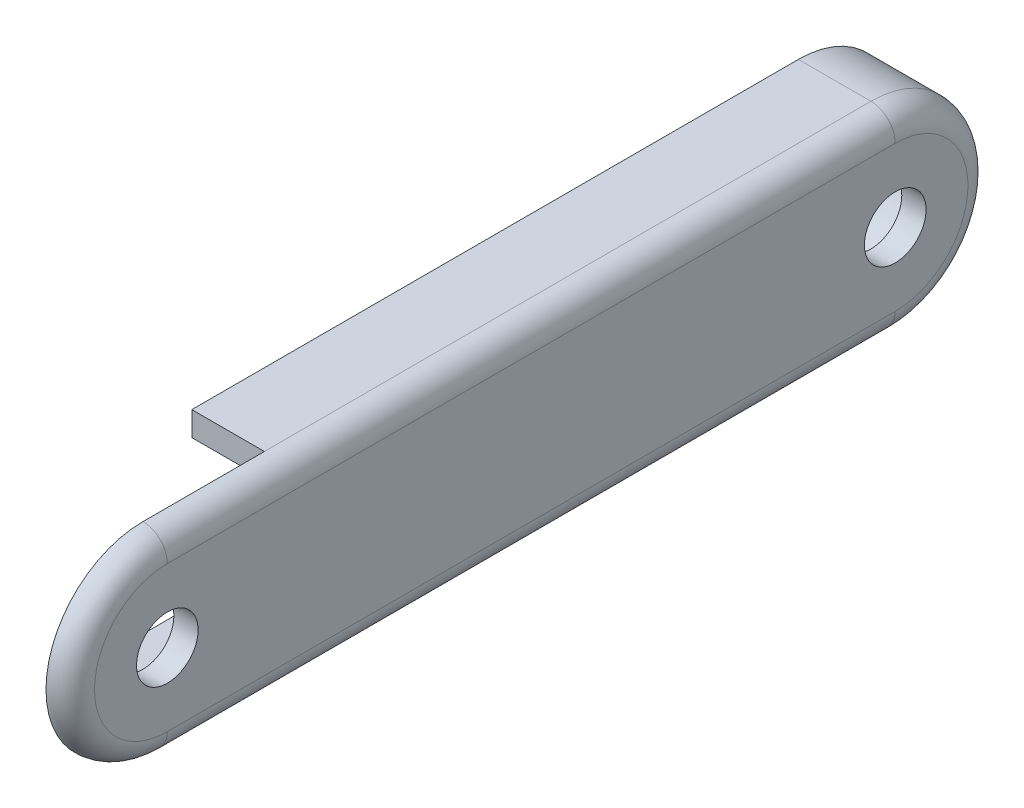
ISO-10303-21;
HEADER;
FILE_DESCRIPTION(('STEP AP214'),'2;1');
FILE_NAME('part.step','',(''),(''),'','','');
FILE_SCHEMA(('AUTOMOTIVE_DESIGN { 1 0 10303 214 1 1 1 1 }'));
ENDSEC;
DATA;
#1=APPLICATION_CONTEXT('core data for automotive mechanical design processes');
#2=APPLICATION_PROTOCOL_DEFINITION('international standard','automotive_design',2000,#1);
#3=PRODUCT_CONTEXT('',#1,'mechanical');
#4=PRODUCT('Part','Part','',(#3));
#5=PRODUCT_RELATED_PRODUCT_CATEGORY('part','',(#4));
#6=PRODUCT_DEFINITION_FORMATION('','',#4);
#7=PRODUCT_DEFINITION_CONTEXT('part definition',#1,'design');
#8=PRODUCT_DEFINITION('design','',#6,#7);
#9=PRODUCT_DEFINITION_SHAPE('','',#8);
#10=(LENGTH_UNIT() NAMED_UNIT(*) SI_UNIT(.MILLI.,.METRE.));
#11=(NAMED_UNIT(*) PLANE_ANGLE_UNIT() SI_UNIT($,.RADIAN.));
#12=(NAMED_UNIT(*) SI_UNIT($,.STERADIAN.) SOLID_ANGLE_UNIT());
#13=UNCERTAINTY_MEASURE_WITH_UNIT(LENGTH_MEASURE(1.E-05),#10,'distance_accuracy_value','');
#14=(GEOMETRIC_REPRESENTATION_CONTEXT(3) GLOBAL_UNCERTAINTY_ASSIGNED_CONTEXT((#13)) GLOBAL_UNIT_ASSIGNED_CONTEXT((#10,
#11,#12)) REPRESENTATION_CONTEXT('',''));
#15=CARTESIAN_POINT('',(0.,0.,0.));
#16=DIRECTION('',(0.,0.,1.));
#17=DIRECTION('',(1.,0.,0.));
#18=AXIS2_PLACEMENT_3D('',#15,#16,#17);
#19=CARTESIAN_POINT('',(34.9,-20.,75.));
#20=DIRECTION('',(0.,1.,0.));
#21=DIRECTION('',(0.,0.,1.));
#22=AXIS2_PLACEMENT_3D('',#19,#20,#21);
#23=PLANE('',#22);
#24=DIRECTION('',(1.,0.,0.));
#25=VECTOR('',#24,1.);
#26=CARTESIAN_POINT('',(19.95,-20.,75.));
#27=LINE('',#26,#25);
#28=CARTESIAN_POINT('',(19.95,-20.,75.));
#29=VERTEX_POINT('',#28);
#30=CARTESIAN_POINT('',(34.9,-20.,75.));
#31=VERTEX_POINT('',#30);
#32=EDGE_CURVE('E198',#29,#31,#27,.T.);
#33=ORIENTED_EDGE('',*,*,#32,.F.);
#34=DIRECTION('',(0.,0.,-1.));
#35=VECTOR('',#34,1.);
#36=CARTESIAN_POINT('',(19.95,-20.,-75.));
#37=LINE('',#36,#35);
#38=CARTESIAN_POINT('',(19.95,-19.9999999999999,-75.));
#39=VERTEX_POINT('',#38);
#40=EDGE_CURVE('E172',#29,#39,#37,.T.);
#41=ORIENTED_EDGE('',*,*,#40,.T.);
#42=DIRECTION('',(1.,0.,0.));
#43=VECTOR('',#42,1.);
#44=CARTESIAN_POINT('',(34.9,-20.,-75.));
#45=LINE('',#44,#43);
#46=CARTESIAN_POINT('',(34.9,-20.,-75.));
#47=VERTEX_POINT('',#46);
#48=EDGE_CURVE('E221',#39,#47,#45,.T.);
#49=ORIENTED_EDGE('',*,*,#48,.T.);
#50=DIRECTION('',(0.,0.,-1.));
#51=VECTOR('',#50,1.);
#52=CARTESIAN_POINT('',(34.9,-20.,75.));
#53=LINE('',#52,#51);
#54=EDGE_CURVE('E11',#31,#47,#53,.T.);
#55=ORIENTED_EDGE('',*,*,#54,.F.);
#56=EDGE_LOOP('',(#33,#41,#49,#55));
#57=FACE_BOUND('',#56,.T.);
#58=ADVANCED_FACE('F41',(#57),#23,.F.);
#59=CARTESIAN_POINT('',(34.9,0.,-75.));
#60=DIRECTION('',(1.,0.,0.));
#61=DIRECTION('',(0.,0.,1.));
#62=AXIS2_PLACEMENT_3D('',#59,#60,#61);
#63=CYLINDRICAL_SURFACE('',#62,20.);
#64=ORIENTED_EDGE('',*,*,#48,.F.);
#65=CARTESIAN_POINT('',(19.95,0.,-75.));
#66=DIRECTION('',(1.,0.,0.));
#67=DIRECTION('',(0.,0.,-1.));
#68=AXIS2_PLACEMENT_3D('',#65,#66,#67);
#69=CIRCLE('',#68,20.);
#70=CARTESIAN_POINT('',(19.95,20.,-75.));
#71=VERTEX_POINT('',#70);
#72=EDGE_CURVE('E176',#39,#71,#69,.T.);
#73=ORIENTED_EDGE('',*,*,#72,.T.);
#74=DIRECTION('',(1.,0.,0.));
#75=VECTOR('',#74,1.);
#76=CARTESIAN_POINT('',(34.9,20.,-75.));
#77=LINE('',#76,#75);
#78=CARTESIAN_POINT('',(34.9,20.,-75.));
#79=VERTEX_POINT('',#78);
#80=EDGE_CURVE('E217',#71,#79,#77,.T.);
#81=ORIENTED_EDGE('',*,*,#80,.T.);
#82=CARTESIAN_POINT('',(34.9,0.,-75.));
#83=DIRECTION('',(1.,0.,0.));
#84=DIRECTION('',(0.,0.,-1.));
#85=AXIS2_PLACEMENT_3D('',#82,#83,#84);
#86=CIRCLE('',#85,20.);
#87=EDGE_CURVE('E51',#47,#79,#86,.T.);
#88=ORIENTED_EDGE('',*,*,#87,.F.);
#89=EDGE_LOOP('',(#64,#73,#81,#88));
#90=FACE_BOUND('',#89,.T.);
#91=ADVANCED_FACE('F292',(#90),#63,.T.);
#92=CARTESIAN_POINT('',(34.9,20.,75.));
#93=DIRECTION('',(0.,-1.,0.));
#94=DIRECTION('',(0.,0.,-1.));
#95=AXIS2_PLACEMENT_3D('',#92,#93,#94);
#96=PLANE('',#95);
#97=ORIENTED_EDGE('',*,*,#80,.F.);
#98=DIRECTION('',(0.,0.,1.));
#99=VECTOR('',#98,1.);
#100=CARTESIAN_POINT('',(19.95,20.,50.));
#101=LINE('',#100,#99);
#102=CARTESIAN_POINT('',(19.95,20.,50.));
#103=VERTEX_POINT('',#102);
#104=EDGE_CURVE('E180',#71,#103,#101,.T.);
#105=ORIENTED_EDGE('',*,*,#104,.T.);
#106=DIRECTION('',(1.,0.,0.));
#107=VECTOR('',#106,1.);
#108=CARTESIAN_POINT('',(19.95,20.,50.));
#109=LINE('',#108,#107);
#110=CARTESIAN_POINT('',(34.9,20.,50.));
#111=VERTEX_POINT('',#110);
#112=EDGE_CURVE('E150',#103,#111,#109,.T.);
#113=ORIENTED_EDGE('',*,*,#112,.T.);
#114=DIRECTION('',(0.,0.,1.));
#115=VECTOR('',#114,1.);
#116=CARTESIAN_POINT('',(34.9,20.,75.));
#117=LINE('',#116,#115);
#118=EDGE_CURVE('E247',#79,#111,#117,.T.);
#119=ORIENTED_EDGE('',*,*,#118,.F.);
#120=EDGE_LOOP('',(#97,#105,#113,#119));
#121=FACE_BOUND('',#120,.T.);
#122=ADVANCED_FACE('F298',(#121),#96,.F.);
#123=CARTESIAN_POINT('',(34.9,0.,75.));
#124=DIRECTION('',(-1.,0.,0.));
#125=DIRECTION('',(0.,0.,-1.));
#126=AXIS2_PLACEMENT_3D('',#123,#124,#125);
#127=PLANE('',#126);
#128=CARTESIAN_POINT('',(34.9,0.,-75.));
#129=DIRECTION('',(1.,0.,0.));
#130=DIRECTION('',(0.,0.,-1.));
#131=AXIS2_PLACEMENT_3D('',#128,#129,#130);
#132=CIRCLE('',#131,6.35);
#133=CARTESIAN_POINT('',(34.9,0.,-81.35));
#134=VERTEX_POINT('',#133);
#135=EDGE_CURVE('E230',#134,#134,#132,.T.);
#136=ORIENTED_EDGE('',*,*,#135,.T.);
#137=EDGE_LOOP('',(#136));
#138=FACE_BOUND('',#137,.T.);
#139=CARTESIAN_POINT('',(34.9,0.,75.));
#140=DIRECTION('',(1.,0.,0.));
#141=DIRECTION('',(0.,0.,-1.));
#142=AXIS2_PLACEMENT_3D('',#139,#140,#141);
#143=CIRCLE('',#142,6.35);
#144=CARTESIAN_POINT('',(34.9,0.,68.65));
#145=VERTEX_POINT('',#144);
#146=EDGE_CURVE('E160',#145,#145,#143,.T.);
#147=ORIENTED_EDGE('',*,*,#146,.T.);
#148=EDGE_LOOP('',(#147));
#149=FACE_BOUND('',#148,.T.);
#150=DIRECTION('',(0.,-1.,0.));
#151=VECTOR('',#150,1.);
#152=CARTESIAN_POINT('',(34.9,15.,50.));
#153=LINE('',#152,#151);
#154=CARTESIAN_POINT('',(34.9,15.,50.));
#155=VERTEX_POINT('',#154);
#156=EDGE_CURVE('E183',#111,#155,#153,.T.);
#157=ORIENTED_EDGE('',*,*,#156,.T.);
#158=DIRECTION('',(0.,0.,-1.));
#159=VECTOR('',#158,1.);
#160=CARTESIAN_POINT('',(34.9,15.,-75.));
#161=LINE('',#160,#159);
#162=CARTESIAN_POINT('',(34.9,15.,-75.));
#163=VERTEX_POINT('',#162);
#164=EDGE_CURVE('E140',#155,#163,#161,.T.);
#165=ORIENTED_EDGE('',*,*,#164,.T.);
#166=CARTESIAN_POINT('',(34.9,0.,-75.));
#167=DIRECTION('',(-1.,0.,0.));
#168=DIRECTION('',(0.,0.,-1.));
#169=AXIS2_PLACEMENT_3D('',#166,#167,#168);
#170=CIRCLE('',#169,15.);
#171=CARTESIAN_POINT('',(34.9,-15.,-75.));
#172=VERTEX_POINT('',#171);
#173=EDGE_CURVE('E189',#163,#172,#170,.T.);
#174=ORIENTED_EDGE('',*,*,#173,.T.);
#175=DIRECTION('',(0.,0.,1.));
#176=VECTOR('',#175,1.);
#177=CARTESIAN_POINT('',(34.9,-15.,75.));
#178=LINE('',#177,#176);
#179=CARTESIAN_POINT('',(34.9,-15.,75.));
#180=VERTEX_POINT('',#179);
#181=EDGE_CURVE('E157',#172,#180,#178,.T.);
#182=ORIENTED_EDGE('',*,*,#181,.T.);
#183=DIRECTION('',(0.,-1.,0.));
#184=VECTOR('',#183,1.);
#185=CARTESIAN_POINT('',(34.9,-20.,75.));
#186=LINE('',#185,#184);
#187=EDGE_CURVE('E153',#180,#31,#186,.T.);
#188=ORIENTED_EDGE('',*,*,#187,.T.);
#189=CARTESIAN_POINT('',(34.9,0.,75.));
#190=DIRECTION('',(1.,0.,0.));
#191=DIRECTION('',(0.,0.,-1.));
#192=AXIS2_PLACEMENT_3D('',#189,#190,#191);
#193=CIRCLE('',#192,20.);
#194=CARTESIAN_POINT('',(34.9,20.,75.));
#195=VERTEX_POINT('',#194);
#196=EDGE_CURVE('E145',#195,#31,#193,.T.);
#197=ORIENTED_EDGE('',*,*,#196,.F.);
#198=DIRECTION('',(0.,0.,1.));
#199=VECTOR('',#198,1.);
#200=CARTESIAN_POINT('',(34.9,20.,75.));
#201=LINE('',#200,#199);
#202=EDGE_CURVE('E213',#111,#195,#201,.T.);
#203=ORIENTED_EDGE('',*,*,#202,.F.);
#204=EDGE_LOOP('',(#157,#165,#174,#182,#188,#197,#203));
#205=FACE_BOUND('',#204,.T.);
#206=ADVANCED_FACE('F267',(#138,#149,#205),#127,.T.);
#207=CARTESIAN_POINT('',(39.9,0.,75.));
#208=DIRECTION('',(-1.,0.,0.));
#209=DIRECTION('',(0.,0.,-1.));
#210=AXIS2_PLACEMENT_3D('',#207,#208,#209);
#211=PLANE('',#210);
#212=DIRECTION('',(0.,0.,-1.));
#213=VECTOR('',#212,1.);
#214=CARTESIAN_POINT('',(39.9,-15.,75.));
#215=LINE('',#214,#213);
#216=CARTESIAN_POINT('',(39.9,-15.,-75.));
#217=VERTEX_POINT('',#216);
#218=CARTESIAN_POINT('',(39.9,-15.,75.));
#219=VERTEX_POINT('',#218);
#220=EDGE_CURVE('E225',#217,#219,#215,.F.);
#221=ORIENTED_EDGE('',*,*,#220,.F.);
#222=CARTESIAN_POINT('',(39.9,0.,-75.));
#223=DIRECTION('',(1.,0.,0.));
#224=DIRECTION('',(0.,0.,-1.));
#225=AXIS2_PLACEMENT_3D('',#222,#223,#224);
#226=CIRCLE('',#225,15.);
#227=CARTESIAN_POINT('',(39.9,15.,-75.));
#228=VERTEX_POINT('',#227);
#229=EDGE_CURVE('E237',#228,#217,#226,.F.);
#230=ORIENTED_EDGE('',*,*,#229,.F.);
#231=DIRECTION('',(0.,0.,1.));
#232=VECTOR('',#231,1.);
#233=CARTESIAN_POINT('',(39.9,15.,75.));
#234=LINE('',#233,#232);
#235=CARTESIAN_POINT('',(39.9,15.,75.));
#236=VERTEX_POINT('',#235);
#237=EDGE_CURVE('E240',#236,#228,#234,.F.);
#238=ORIENTED_EDGE('',*,*,#237,.F.);
#239=CARTESIAN_POINT('',(39.9,0.,75.));
#240=DIRECTION('',(1.,0.,0.));
#241=DIRECTION('',(0.,0.,-1.));
#242=AXIS2_PLACEMENT_3D('',#239,#240,#241);
#243=CIRCLE('',#242,15.);
#244=EDGE_CURVE('E243',#219,#236,#243,.F.);
#245=ORIENTED_EDGE('',*,*,#244,.F.);
#246=EDGE_LOOP('',(#221,#230,#238,#245));
#247=FACE_BOUND('',#246,.T.);
#248=CARTESIAN_POINT('',(39.9,0.,-75.));
#249=DIRECTION('',(1.,0.,0.));
#250=DIRECTION('',(0.,0.,-1.));
#251=AXIS2_PLACEMENT_3D('',#248,#249,#250);
#252=CIRCLE('',#251,6.35);
#253=CARTESIAN_POINT('',(39.9,0.,-81.35));
#254=VERTEX_POINT('',#253);
#255=EDGE_CURVE('E186',#254,#254,#252,.T.);
#256=ORIENTED_EDGE('',*,*,#255,.F.);
#257=EDGE_LOOP('',(#256));
#258=FACE_BOUND('',#257,.T.);
#259=CARTESIAN_POINT('',(39.9,0.,75.));
#260=DIRECTION('',(1.,0.,0.));
#261=DIRECTION('',(0.,0.,-1.));
#262=AXIS2_PLACEMENT_3D('',#259,#260,#261);
#263=CIRCLE('',#262,6.35);
#264=CARTESIAN_POINT('',(39.9,0.,68.65));
#265=VERTEX_POINT('',#264);
#266=EDGE_CURVE('E226',#265,#265,#263,.T.);
#267=ORIENTED_EDGE('',*,*,#266,.F.);
#268=EDGE_LOOP('',(#267));
#269=FACE_BOUND('',#268,.T.);
#270=ADVANCED_FACE('F276',(#247,#258,#269),#211,.F.);
#271=CARTESIAN_POINT('',(19.95,15.,50.));
#272=DIRECTION('',(0.,0.,-1.));
#273=DIRECTION('',(1.,0.,0.));
#274=AXIS2_PLACEMENT_3D('',#271,#272,#273);
#275=PLANE('',#274);
#276=ORIENTED_EDGE('',*,*,#156,.F.);
#277=ORIENTED_EDGE('',*,*,#112,.F.);
#278=DIRECTION('',(0.,-1.,0.));
#279=VECTOR('',#278,1.);
#280=CARTESIAN_POINT('',(19.95,15.,50.));
#281=LINE('',#280,#279);
#282=CARTESIAN_POINT('',(19.95,15.,50.));
#283=VERTEX_POINT('',#282);
#284=EDGE_CURVE('E128',#103,#283,#281,.T.);
#285=ORIENTED_EDGE('',*,*,#284,.T.);
#286=DIRECTION('',(1.,0.,0.));
#287=VECTOR('',#286,1.);
#288=CARTESIAN_POINT('',(19.95,15.,50.));
#289=LINE('',#288,#287);
#290=EDGE_CURVE('E137',#283,#155,#289,.T.);
#291=ORIENTED_EDGE('',*,*,#290,.T.);
#292=EDGE_LOOP('',(#276,#277,#285,#291));
#293=FACE_BOUND('',#292,.T.);
#294=ADVANCED_FACE('F148',(#293),#275,.F.);
#295=CARTESIAN_POINT('',(19.95,15.,-75.));
#296=DIRECTION('',(0.,1.,0.));
#297=DIRECTION('',(0.,0.,1.));
#298=AXIS2_PLACEMENT_3D('',#295,#296,#297);
#299=PLANE('',#298);
#300=ORIENTED_EDGE('',*,*,#164,.F.);
#301=ORIENTED_EDGE('',*,*,#290,.F.);
#302=DIRECTION('',(0.,0.,-1.));
#303=VECTOR('',#302,1.);
#304=CARTESIAN_POINT('',(19.95,15.,-75.));
#305=LINE('',#304,#303);
#306=CARTESIAN_POINT('',(19.95,15.,-75.));
#307=VERTEX_POINT('',#306);
#308=EDGE_CURVE('E124',#283,#307,#305,.T.);
#309=ORIENTED_EDGE('',*,*,#308,.T.);
#310=DIRECTION('',(1.,0.,0.));
#311=VECTOR('',#310,1.);
#312=CARTESIAN_POINT('',(19.95,15.,-75.));
#313=LINE('',#312,#311);
#314=EDGE_CURVE('E146',#307,#163,#313,.T.);
#315=ORIENTED_EDGE('',*,*,#314,.T.);
#316=EDGE_LOOP('',(#300,#301,#309,#315));
#317=FACE_BOUND('',#316,.T.);
#318=ADVANCED_FACE('F138',(#317),#299,.F.);
#319=CARTESIAN_POINT('',(19.95,0.,-75.));
#320=DIRECTION('',(1.,0.,0.));
#321=DIRECTION('',(0.,0.,1.));
#322=AXIS2_PLACEMENT_3D('',#319,#320,#321);
#323=CYLINDRICAL_SURFACE('',#322,15.);
#324=ORIENTED_EDGE('',*,*,#173,.F.);
#325=ORIENTED_EDGE('',*,*,#314,.F.);
#326=CARTESIAN_POINT('',(19.95,0.,-75.));
#327=DIRECTION('',(-1.,0.,0.));
#328=DIRECTION('',(0.,0.,-1.));
#329=AXIS2_PLACEMENT_3D('',#326,#327,#328);
#330=CIRCLE('',#329,15.);
#331=CARTESIAN_POINT('',(19.95,-15.,-75.));
#332=VERTEX_POINT('',#331);
#333=EDGE_CURVE('E131',#307,#332,#330,.T.);
#334=ORIENTED_EDGE('',*,*,#333,.T.);
#335=DIRECTION('',(1.,0.,0.));
#336=VECTOR('',#335,1.);
#337=CARTESIAN_POINT('',(19.95,-15.,-75.));
#338=LINE('',#337,#336);
#339=EDGE_CURVE('E205',#332,#172,#338,.T.);
#340=ORIENTED_EDGE('',*,*,#339,.T.);
#341=EDGE_LOOP('',(#324,#325,#334,#340));
#342=FACE_BOUND('',#341,.T.);
#343=ADVANCED_FACE('F351',(#342),#323,.F.);
#344=CARTESIAN_POINT('',(19.95,-15.,75.));
#345=DIRECTION('',(0.,-1.,0.));
#346=DIRECTION('',(0.,0.,-1.));
#347=AXIS2_PLACEMENT_3D('',#344,#345,#346);
#348=PLANE('',#347);
#349=ORIENTED_EDGE('',*,*,#181,.F.);
#350=ORIENTED_EDGE('',*,*,#339,.F.);
#351=DIRECTION('',(0.,0.,1.));
#352=VECTOR('',#351,1.);
#353=CARTESIAN_POINT('',(19.95,-15.,75.));
#354=LINE('',#353,#352);
#355=CARTESIAN_POINT('',(19.95,-15.,75.));
#356=VERTEX_POINT('',#355);
#357=EDGE_CURVE('E165',#332,#356,#354,.T.);
#358=ORIENTED_EDGE('',*,*,#357,.T.);
#359=DIRECTION('',(1.,0.,0.));
#360=VECTOR('',#359,1.);
#361=CARTESIAN_POINT('',(19.95,-15.,75.));
#362=LINE('',#361,#360);
#363=EDGE_CURVE('E202',#356,#180,#362,.T.);
#364=ORIENTED_EDGE('',*,*,#363,.T.);
#365=EDGE_LOOP('',(#349,#350,#358,#364));
#366=FACE_BOUND('',#365,.T.);
#367=ADVANCED_FACE('F341',(#366),#348,.F.);
#368=CARTESIAN_POINT('',(19.95,-20.,75.));
#369=DIRECTION('',(0.,0.,-1.));
#370=DIRECTION('',(1.,0.,0.));
#371=AXIS2_PLACEMENT_3D('',#368,#369,#370);
#372=PLANE('',#371);
#373=ORIENTED_EDGE('',*,*,#187,.F.);
#374=ORIENTED_EDGE('',*,*,#363,.F.);
#375=DIRECTION('',(0.,-1.,0.));
#376=VECTOR('',#375,1.);
#377=CARTESIAN_POINT('',(19.95,-20.,75.));
#378=LINE('',#377,#376);
#379=EDGE_CURVE('E169',#356,#29,#378,.T.);
#380=ORIENTED_EDGE('',*,*,#379,.T.);
#381=ORIENTED_EDGE('',*,*,#32,.T.);
#382=EDGE_LOOP('',(#373,#374,#380,#381));
#383=FACE_BOUND('',#382,.T.);
#384=ADVANCED_FACE('F289',(#383),#372,.F.);
#385=CARTESIAN_POINT('',(19.95,0.,-75.));
#386=DIRECTION('',(-1.,0.,0.));
#387=DIRECTION('',(0.,0.,-1.));
#388=AXIS2_PLACEMENT_3D('',#385,#386,#387);
#389=PLANE('',#388);
#390=ORIENTED_EDGE('',*,*,#284,.F.);
#391=ORIENTED_EDGE('',*,*,#104,.F.);
#392=ORIENTED_EDGE('',*,*,#72,.F.);
#393=ORIENTED_EDGE('',*,*,#40,.F.);
#394=ORIENTED_EDGE('',*,*,#379,.F.);
#395=ORIENTED_EDGE('',*,*,#357,.F.);
#396=ORIENTED_EDGE('',*,*,#333,.F.);
#397=ORIENTED_EDGE('',*,*,#308,.F.);
#398=EDGE_LOOP('',(#390,#391,#392,#393,#394,#395,#396,#397));
#399=FACE_BOUND('',#398,.T.);
#400=ADVANCED_FACE('F126',(#399),#389,.T.);
#401=CARTESIAN_POINT('',(49.9,0.,75.));
#402=DIRECTION('',(-1.,0.,0.));
#403=DIRECTION('',(0.,0.,-1.));
#404=AXIS2_PLACEMENT_3D('',#401,#402,#403);
#405=CYLINDRICAL_SURFACE('',#404,6.35);
#406=ORIENTED_EDGE('',*,*,#146,.F.);
#407=EDGE_LOOP('',(#406));
#408=FACE_BOUND('',#407,.T.);
#409=ORIENTED_EDGE('',*,*,#266,.T.);
#410=EDGE_LOOP('',(#409));
#411=FACE_BOUND('',#410,.T.);
#412=ADVANCED_FACE('F272',(#408,#411),#405,.F.);
#413=CARTESIAN_POINT('',(49.9,0.,-75.));
#414=DIRECTION('',(-1.,0.,0.));
#415=DIRECTION('',(0.,0.,-1.));
#416=AXIS2_PLACEMENT_3D('',#413,#414,#415);
#417=CYLINDRICAL_SURFACE('',#416,6.35);
#418=ORIENTED_EDGE('',*,*,#135,.F.);
#419=EDGE_LOOP('',(#418));
#420=FACE_BOUND('',#419,.T.);
#421=ORIENTED_EDGE('',*,*,#255,.T.);
#422=EDGE_LOOP('',(#421));
#423=FACE_BOUND('',#422,.T.);
#424=ADVANCED_FACE('F269',(#420,#423),#417,.F.);
#425=CARTESIAN_POINT('',(34.9,0.,-75.));
#426=DIRECTION('',(-1.,0.,0.));
#427=DIRECTION('',(0.,0.,-1.));
#428=AXIS2_PLACEMENT_3D('',#425,#426,#427);
#429=TOROIDAL_SURFACE('',#428,15.,5.);
#430=CARTESIAN_POINT('',(34.9,-15.,-75.));
#431=DIRECTION('',(0.,0.,-1.));
#432=DIRECTION('',(-1.,0.,0.));
#433=AXIS2_PLACEMENT_3D('',#430,#431,#432);
#434=CIRCLE('',#433,5.);
#435=EDGE_CURVE('E59',#217,#47,#434,.T.);
#436=ORIENTED_EDGE('',*,*,#435,.T.);
#437=ORIENTED_EDGE('',*,*,#87,.T.);
#438=CARTESIAN_POINT('',(34.9,15.,-75.));
#439=DIRECTION('',(0.,0.,-1.));
#440=DIRECTION('',(-1.,0.,0.));
#441=AXIS2_PLACEMENT_3D('',#438,#439,#440);
#442=CIRCLE('',#441,5.);
#443=EDGE_CURVE('E45',#79,#228,#442,.T.);
#444=ORIENTED_EDGE('',*,*,#443,.T.);
#445=ORIENTED_EDGE('',*,*,#229,.T.);
#446=EDGE_LOOP('',(#436,#437,#444,#445));
#447=FACE_BOUND('',#446,.T.);
#448=ADVANCED_FACE('F43',(#447),#429,.T.);
#449=CARTESIAN_POINT('',(34.9,15.,75.));
#450=DIRECTION('',(0.,0.,1.));
#451=DIRECTION('',(0.,-1.,0.));
#452=AXIS2_PLACEMENT_3D('',#449,#450,#451);
#453=CYLINDRICAL_SURFACE('',#452,5.);
#454=ORIENTED_EDGE('',*,*,#443,.F.);
#455=ORIENTED_EDGE('',*,*,#118,.T.);
#456=ORIENTED_EDGE('',*,*,#202,.T.);
#457=CARTESIAN_POINT('',(34.9,15.,75.));
#458=DIRECTION('',(0.,0.,-1.));
#459=DIRECTION('',(-1.,0.,0.));
#460=AXIS2_PLACEMENT_3D('',#457,#458,#459);
#461=CIRCLE('',#460,5.);
#462=EDGE_CURVE('E255',#195,#236,#461,.T.);
#463=ORIENTED_EDGE('',*,*,#462,.T.);
#464=ORIENTED_EDGE('',*,*,#237,.T.);
#465=EDGE_LOOP('',(#454,#455,#456,#463,#464));
#466=FACE_BOUND('',#465,.T.);
#467=ADVANCED_FACE('F310',(#466),#453,.T.);
#468=CARTESIAN_POINT('',(34.9,-15.,75.));
#469=DIRECTION('',(0.,0.,-1.));
#470=DIRECTION('',(0.,1.,0.));
#471=AXIS2_PLACEMENT_3D('',#468,#469,#470);
#472=CYLINDRICAL_SURFACE('',#471,5.);
#473=ORIENTED_EDGE('',*,*,#435,.F.);
#474=ORIENTED_EDGE('',*,*,#220,.T.);
#475=CARTESIAN_POINT('',(34.9,-15.,75.));
#476=DIRECTION('',(0.,0.,-1.));
#477=DIRECTION('',(-1.,0.,0.));
#478=AXIS2_PLACEMENT_3D('',#475,#476,#477);
#479=CIRCLE('',#478,5.);
#480=EDGE_CURVE('E252',#219,#31,#479,.T.);
#481=ORIENTED_EDGE('',*,*,#480,.T.);
#482=ORIENTED_EDGE('',*,*,#54,.T.);
#483=EDGE_LOOP('',(#473,#474,#481,#482));
#484=FACE_BOUND('',#483,.T.);
#485=ADVANCED_FACE('F307',(#484),#472,.T.);
#486=CARTESIAN_POINT('',(34.9,0.,75.));
#487=DIRECTION('',(-1.,0.,0.));
#488=DIRECTION('',(0.,0.,-1.));
#489=AXIS2_PLACEMENT_3D('',#486,#487,#488);
#490=TOROIDAL_SURFACE('',#489,15.,5.);
#491=ORIENTED_EDGE('',*,*,#462,.F.);
#492=ORIENTED_EDGE('',*,*,#196,.T.);
#493=ORIENTED_EDGE('',*,*,#480,.F.);
#494=ORIENTED_EDGE('',*,*,#244,.T.);
#495=EDGE_LOOP('',(#491,#492,#493,#494));
#496=FACE_BOUND('',#495,.T.);
#497=ADVANCED_FACE('F304',(#496),#490,.T.);
#498=CLOSED_SHELL('',(#58,#91,#122,#206,#270,#294,#318,#343,#367,#384,#400,#412,#424,#448,#467,
#485,#497));
#499=MANIFOLD_SOLID_BREP('B2',#498);
#500=ADVANCED_BREP_SHAPE_REPRESENTATION('',(#18,#499),#14);
#501=SHAPE_DEFINITION_REPRESENTATION(#9,#500);
ENDSEC;
END-ISO-10303-21;
